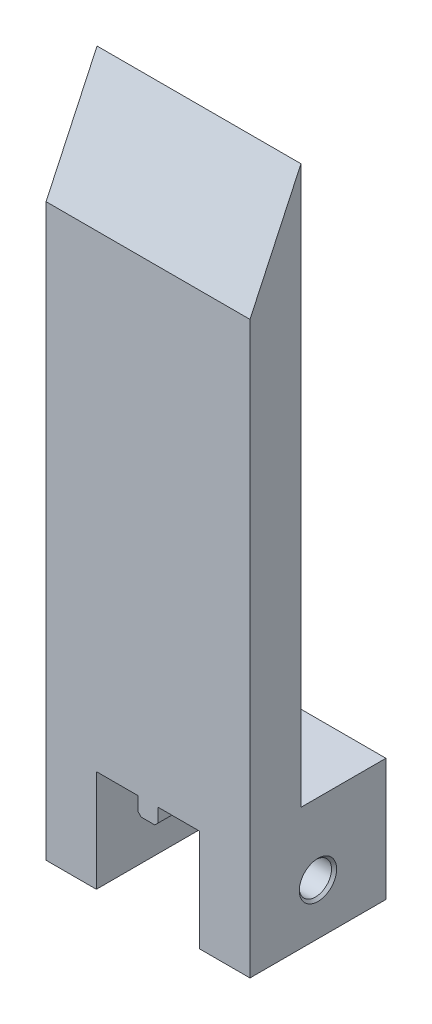
ISO-10303-21;
HEADER;
FILE_DESCRIPTION(('STEP AP214'),'2;1');
FILE_NAME('part.step','',(''),(''),'','','');
FILE_SCHEMA(('AUTOMOTIVE_DESIGN { 1 0 10303 214 1 1 1 1 }'));
ENDSEC;
DATA;
#1=APPLICATION_CONTEXT('core data for automotive mechanical design processes');
#2=APPLICATION_PROTOCOL_DEFINITION('international standard','automotive_design',2000,#1);
#3=PRODUCT_CONTEXT('',#1,'mechanical');
#4=PRODUCT('Part','Part','',(#3));
#5=PRODUCT_RELATED_PRODUCT_CATEGORY('part','',(#4));
#6=PRODUCT_DEFINITION_FORMATION('','',#4);
#7=PRODUCT_DEFINITION_CONTEXT('part definition',#1,'design');
#8=PRODUCT_DEFINITION('design','',#6,#7);
#9=PRODUCT_DEFINITION_SHAPE('','',#8);
#10=(LENGTH_UNIT() NAMED_UNIT(*) SI_UNIT(.MILLI.,.METRE.));
#11=(NAMED_UNIT(*) PLANE_ANGLE_UNIT() SI_UNIT($,.RADIAN.));
#12=(NAMED_UNIT(*) SI_UNIT($,.STERADIAN.) SOLID_ANGLE_UNIT());
#13=UNCERTAINTY_MEASURE_WITH_UNIT(LENGTH_MEASURE(1.E-05),#10,'distance_accuracy_value','');
#14=(GEOMETRIC_REPRESENTATION_CONTEXT(3) GLOBAL_UNCERTAINTY_ASSIGNED_CONTEXT((#13)) GLOBAL_UNIT_ASSIGNED_CONTEXT((#10,
#11,#12)) REPRESENTATION_CONTEXT('',''));
#15=CARTESIAN_POINT('',(0.,0.,0.));
#16=DIRECTION('',(0.,0.,1.));
#17=DIRECTION('',(1.,0.,0.));
#18=AXIS2_PLACEMENT_3D('',#15,#16,#17);
#19=CARTESIAN_POINT('',(-15.,-85.,40.));
#20=DIRECTION('',(0.,1.,0.));
#21=DIRECTION('',(0.,0.,1.));
#22=AXIS2_PLACEMENT_3D('',#19,#20,#21);
#23=PLANE('',#22);
#24=CARTESIAN_POINT('',(0.,-85.,10.0000000000002));
#25=DIRECTION('',(0.,1.,0.));
#26=DIRECTION('',(0.,0.,1.));
#27=AXIS2_PLACEMENT_3D('',#24,#25,#26);
#28=CIRCLE('',#27,2.75000000000001);
#29=CARTESIAN_POINT('',(0.,-85.,12.7500000000002));
#30=VERTEX_POINT('',#29);
#31=EDGE_CURVE('E300',#30,#30,#28,.T.);
#32=ORIENTED_EDGE('',*,*,#31,.T.);
#33=EDGE_LOOP('',(#32));
#34=FACE_BOUND('',#33,.T.);
#35=DIRECTION('',(0.,0.,-1.));
#36=VECTOR('',#35,1.);
#37=CARTESIAN_POINT('',(15.2,-85.,40.));
#38=LINE('',#37,#36);
#39=CARTESIAN_POINT('',(15.2,-85.,40.));
#40=VERTEX_POINT('',#39);
#41=CARTESIAN_POINT('',(15.2,-85.,0.));
#42=VERTEX_POINT('',#41);
#43=EDGE_CURVE('E64',#40,#42,#38,.T.);
#44=ORIENTED_EDGE('',*,*,#43,.F.);
#45=DIRECTION('',(1.,0.,0.));
#46=VECTOR('',#45,1.);
#47=CARTESIAN_POINT('',(-15.,-85.,40.));
#48=LINE('',#47,#46);
#49=CARTESIAN_POINT('',(3.00000000000001,-85.,40.));
#50=VERTEX_POINT('',#49);
#51=EDGE_CURVE('E319',#50,#40,#48,.T.);
#52=ORIENTED_EDGE('',*,*,#51,.F.);
#53=DIRECTION('',(0.,0.,1.));
#54=VECTOR('',#53,1.);
#55=CARTESIAN_POINT('',(3.00000000000001,-85.,40.));
#56=LINE('',#55,#54);
#57=CARTESIAN_POINT('',(3.00000000000001,-85.,25.));
#58=VERTEX_POINT('',#57);
#59=EDGE_CURVE('E255',#58,#50,#56,.T.);
#60=ORIENTED_EDGE('',*,*,#59,.F.);
#61=DIRECTION('',(1.,0.,0.));
#62=VECTOR('',#61,1.);
#63=CARTESIAN_POINT('',(3.00000000000001,-85.,25.));
#64=LINE('',#63,#62);
#65=CARTESIAN_POINT('',(-2.99999999999999,-85.,25.));
#66=VERTEX_POINT('',#65);
#67=EDGE_CURVE('E261',#66,#58,#64,.T.);
#68=ORIENTED_EDGE('',*,*,#67,.F.);
#69=DIRECTION('',(0.,0.,-1.));
#70=VECTOR('',#69,1.);
#71=CARTESIAN_POINT('',(-2.99999999999999,-85.,40.));
#72=LINE('',#71,#70);
#73=CARTESIAN_POINT('',(-2.99999999999999,-85.,40.));
#74=VERTEX_POINT('',#73);
#75=EDGE_CURVE('E269',#74,#66,#72,.T.);
#76=ORIENTED_EDGE('',*,*,#75,.F.);
#77=CARTESIAN_POINT('',(-15.2,-85.,40.));
#78=VERTEX_POINT('',#77);
#79=EDGE_CURVE('E315',#78,#74,#48,.T.);
#80=ORIENTED_EDGE('',*,*,#79,.F.);
#81=DIRECTION('',(0.,0.,1.));
#82=VECTOR('',#81,1.);
#83=CARTESIAN_POINT('',(-15.2,-85.,40.));
#84=LINE('',#83,#82);
#85=CARTESIAN_POINT('',(-15.2,-85.,0.));
#86=VERTEX_POINT('',#85);
#87=EDGE_CURVE('E196',#86,#78,#84,.T.);
#88=ORIENTED_EDGE('',*,*,#87,.F.);
#89=DIRECTION('',(1.,0.,0.));
#90=VECTOR('',#89,1.);
#91=CARTESIAN_POINT('',(-15.,-85.,0.));
#92=LINE('',#91,#90);
#93=EDGE_CURVE('E69',#86,#42,#92,.T.);
#94=ORIENTED_EDGE('',*,*,#93,.T.);
#95=EDGE_LOOP('',(#44,#52,#60,#68,#76,#80,#88,#94));
#96=FACE_BOUND('',#95,.T.);
#97=ADVANCED_FACE('F47',(#34,#96),#23,.F.);
#98=CARTESIAN_POINT('',(0.,0.,40.));
#99=DIRECTION('',(0.,0.,1.));
#100=DIRECTION('',(1.,0.,0.));
#101=AXIS2_PLACEMENT_3D('',#98,#99,#100);
#102=PLANE('',#101);
#103=DIRECTION('',(-1.,0.,0.));
#104=VECTOR('',#103,1.);
#105=CARTESIAN_POINT('',(3.00000000000001,-90.,40.));
#106=LINE('',#105,#104);
#107=CARTESIAN_POINT('',(2.00000000000001,-90.,40.));
#108=VERTEX_POINT('',#107);
#109=CARTESIAN_POINT('',(-1.99999999999996,-90.,40.));
#110=VERTEX_POINT('',#109);
#111=EDGE_CURVE('E256',#108,#110,#106,.T.);
#112=ORIENTED_EDGE('',*,*,#111,.F.);
#113=DIRECTION('',(-0.707106781186548,-0.707106781186548,0.));
#114=VECTOR('',#113,1.);
#115=CARTESIAN_POINT('',(46.,-46.,40.));
#116=LINE('',#115,#114);
#117=CARTESIAN_POINT('',(3.00000000000001,-89.,40.));
#118=VERTEX_POINT('',#117);
#119=EDGE_CURVE('E332',#108,#118,#116,.F.);
#120=ORIENTED_EDGE('',*,*,#119,.T.);
#121=DIRECTION('',(0.,1.,0.));
#122=VECTOR('',#121,1.);
#123=CARTESIAN_POINT('',(3.00000000000001,-90.,40.));
#124=LINE('',#123,#122);
#125=EDGE_CURVE('E285',#118,#50,#124,.T.);
#126=ORIENTED_EDGE('',*,*,#125,.T.);
#127=ORIENTED_EDGE('',*,*,#51,.T.);
#128=DIRECTION('',(0.,1.,0.));
#129=VECTOR('',#128,1.);
#130=CARTESIAN_POINT('',(15.2,-115.,40.));
#131=LINE('',#130,#129);
#132=CARTESIAN_POINT('',(15.2,-115.,40.));
#133=VERTEX_POINT('',#132);
#134=EDGE_CURVE('E377',#133,#40,#131,.T.);
#135=ORIENTED_EDGE('',*,*,#134,.F.);
#136=DIRECTION('',(-1.,0.,0.));
#137=VECTOR('',#136,1.);
#138=CARTESIAN_POINT('',(30.,-115.,40.));
#139=LINE('',#138,#137);
#140=CARTESIAN_POINT('',(30.,-115.,40.));
#141=VERTEX_POINT('',#140);
#142=EDGE_CURVE('E192',#141,#133,#139,.T.);
#143=ORIENTED_EDGE('',*,*,#142,.F.);
#144=DIRECTION('',(0.,1.,0.));
#145=VECTOR('',#144,1.);
#146=CARTESIAN_POINT('',(30.,-85.,40.));
#147=LINE('',#146,#145);
#148=CARTESIAN_POINT('',(30.,52.8323961923561,40.));
#149=VERTEX_POINT('',#148);
#150=EDGE_CURVE('E174',#141,#149,#147,.T.);
#151=ORIENTED_EDGE('',*,*,#150,.T.);
#152=DIRECTION('',(1.,0.,0.));
#153=VECTOR('',#152,1.);
#154=CARTESIAN_POINT('',(-15.,52.8323961923561,40.));
#155=LINE('',#154,#153);
#156=CARTESIAN_POINT('',(-30.,52.8323961923561,40.));
#157=VERTEX_POINT('',#156);
#158=EDGE_CURVE('E307',#157,#149,#155,.T.);
#159=ORIENTED_EDGE('',*,*,#158,.F.);
#160=DIRECTION('',(0.,1.,0.));
#161=VECTOR('',#160,1.);
#162=CARTESIAN_POINT('',(-30.,-85.,40.));
#163=LINE('',#162,#161);
#164=CARTESIAN_POINT('',(-30.,-115.,40.));
#165=VERTEX_POINT('',#164);
#166=EDGE_CURVE('E247',#165,#157,#163,.T.);
#167=ORIENTED_EDGE('',*,*,#166,.F.);
#168=DIRECTION('',(-1.,0.,0.));
#169=VECTOR('',#168,1.);
#170=CARTESIAN_POINT('',(-30.,-115.,40.));
#171=LINE('',#170,#169);
#172=CARTESIAN_POINT('',(-15.2,-115.,40.));
#173=VERTEX_POINT('',#172);
#174=EDGE_CURVE('E211',#173,#165,#171,.T.);
#175=ORIENTED_EDGE('',*,*,#174,.F.);
#176=DIRECTION('',(0.,1.,0.));
#177=VECTOR('',#176,1.);
#178=CARTESIAN_POINT('',(-15.2,-115.,40.));
#179=LINE('',#178,#177);
#180=EDGE_CURVE('E215',#173,#78,#179,.T.);
#181=ORIENTED_EDGE('',*,*,#180,.T.);
#182=ORIENTED_EDGE('',*,*,#79,.T.);
#183=DIRECTION('',(0.,1.,0.));
#184=VECTOR('',#183,1.);
#185=CARTESIAN_POINT('',(-2.99999999999999,-90.,40.));
#186=LINE('',#185,#184);
#187=CARTESIAN_POINT('',(-2.99999999999999,-89.,40.));
#188=VERTEX_POINT('',#187);
#189=EDGE_CURVE('E281',#188,#74,#186,.T.);
#190=ORIENTED_EDGE('',*,*,#189,.F.);
#191=DIRECTION('',(-0.707106781186548,0.707106781186547,0.));
#192=VECTOR('',#191,1.);
#193=CARTESIAN_POINT('',(-46.,-46.,40.));
#194=LINE('',#193,#192);
#195=EDGE_CURVE('E329',#188,#110,#194,.F.);
#196=ORIENTED_EDGE('',*,*,#195,.T.);
#197=EDGE_LOOP('',(#112,#120,#126,#127,#135,#143,#151,#159,#167,#175,#181,#182,#190,#196));
#198=FACE_BOUND('',#197,.T.);
#199=ADVANCED_FACE('F356',(#198),#102,.T.);
#200=CARTESIAN_POINT('',(0.,0.,0.));
#201=DIRECTION('',(0.,0.,1.));
#202=DIRECTION('',(1.,0.,0.));
#203=AXIS2_PLACEMENT_3D('',#200,#201,#202);
#204=PLANE('',#203);
#205=ORIENTED_EDGE('',*,*,#93,.F.);
#206=DIRECTION('',(0.,1.,0.));
#207=VECTOR('',#206,1.);
#208=CARTESIAN_POINT('',(-15.2,-115.,0.));
#209=LINE('',#208,#207);
#210=CARTESIAN_POINT('',(-15.2,-115.,0.));
#211=VERTEX_POINT('',#210);
#212=EDGE_CURVE('E221',#211,#86,#209,.T.);
#213=ORIENTED_EDGE('',*,*,#212,.F.);
#214=DIRECTION('',(1.,0.,0.));
#215=VECTOR('',#214,1.);
#216=CARTESIAN_POINT('',(-30.,-115.,0.));
#217=LINE('',#216,#215);
#218=CARTESIAN_POINT('',(-30.,-115.,0.));
#219=VERTEX_POINT('',#218);
#220=EDGE_CURVE('E205',#219,#211,#217,.T.);
#221=ORIENTED_EDGE('',*,*,#220,.F.);
#222=DIRECTION('',(0.,-1.,0.));
#223=VECTOR('',#222,1.);
#224=CARTESIAN_POINT('',(-30.,-79.,0.));
#225=LINE('',#224,#223);
#226=CARTESIAN_POINT('',(-30.,-79.,0.));
#227=VERTEX_POINT('',#226);
#228=EDGE_CURVE('E244',#227,#219,#225,.T.);
#229=ORIENTED_EDGE('',*,*,#228,.F.);
#230=DIRECTION('',(-1.,0.,0.));
#231=VECTOR('',#230,1.);
#232=CARTESIAN_POINT('',(15.,-79.,0.));
#233=LINE('',#232,#231);
#234=CARTESIAN_POINT('',(30.,-79.,0.));
#235=VERTEX_POINT('',#234);
#236=EDGE_CURVE('E167',#235,#227,#233,.T.);
#237=ORIENTED_EDGE('',*,*,#236,.F.);
#238=DIRECTION('',(0.,-1.,0.));
#239=VECTOR('',#238,1.);
#240=CARTESIAN_POINT('',(30.,-79.,0.));
#241=LINE('',#240,#239);
#242=CARTESIAN_POINT('',(30.,-115.,0.));
#243=VERTEX_POINT('',#242);
#244=EDGE_CURVE('E161',#235,#243,#241,.T.);
#245=ORIENTED_EDGE('',*,*,#244,.T.);
#246=DIRECTION('',(1.,0.,0.));
#247=VECTOR('',#246,1.);
#248=CARTESIAN_POINT('',(30.,-115.,0.));
#249=LINE('',#248,#247);
#250=CARTESIAN_POINT('',(15.2,-115.,0.));
#251=VERTEX_POINT('',#250);
#252=EDGE_CURVE('E165',#251,#243,#249,.T.);
#253=ORIENTED_EDGE('',*,*,#252,.F.);
#254=DIRECTION('',(0.,1.,0.));
#255=VECTOR('',#254,1.);
#256=CARTESIAN_POINT('',(15.2,-115.,0.));
#257=LINE('',#256,#255);
#258=EDGE_CURVE('E184',#251,#42,#257,.T.);
#259=ORIENTED_EDGE('',*,*,#258,.T.);
#260=EDGE_LOOP('',(#205,#213,#221,#229,#237,#245,#253,#259));
#261=FACE_BOUND('',#260,.T.);
#262=ADVANCED_FACE('F163',(#261),#204,.F.);
#263=CARTESIAN_POINT('',(-15.,52.8323961923561,40.));
#264=DIRECTION('',(0.,-0.422618261740693,-0.906307787036653));
#265=DIRECTION('',(0.,0.906307787036653,-0.422618261740693));
#266=AXIS2_PLACEMENT_3D('',#263,#264,#265);
#267=PLANE('',#266);
#268=ORIENTED_EDGE('',*,*,#158,.T.);
#269=DIRECTION('',(0.,0.906307787036653,-0.422618261740694));
#270=VECTOR('',#269,1.);
#271=CARTESIAN_POINT('',(30.,52.8323961923561,40.));
#272=LINE('',#271,#270);
#273=CARTESIAN_POINT('',(30.,85.,25.));
#274=VERTEX_POINT('',#273);
#275=EDGE_CURVE('E228',#149,#274,#272,.T.);
#276=ORIENTED_EDGE('',*,*,#275,.T.);
#277=DIRECTION('',(1.,0.,0.));
#278=VECTOR('',#277,1.);
#279=CARTESIAN_POINT('',(-15.,85.,25.));
#280=LINE('',#279,#278);
#281=CARTESIAN_POINT('',(-30.,85.,25.));
#282=VERTEX_POINT('',#281);
#283=EDGE_CURVE('E310',#282,#274,#280,.T.);
#284=ORIENTED_EDGE('',*,*,#283,.F.);
#285=DIRECTION('',(0.,0.906307787036653,-0.422618261740694));
#286=VECTOR('',#285,1.);
#287=CARTESIAN_POINT('',(-30.,52.8323961923561,40.));
#288=LINE('',#287,#286);
#289=EDGE_CURVE('E251',#157,#282,#288,.T.);
#290=ORIENTED_EDGE('',*,*,#289,.F.);
#291=EDGE_LOOP('',(#268,#276,#284,#290));
#292=FACE_BOUND('',#291,.T.);
#293=ADVANCED_FACE('F439',(#292),#267,.F.);
#294=CARTESIAN_POINT('',(15.,85.,25.));
#295=DIRECTION('',(0.,0.,1.));
#296=DIRECTION('',(0.,-1.,0.));
#297=AXIS2_PLACEMENT_3D('',#294,#295,#296);
#298=PLANE('',#297);
#299=DIRECTION('',(-1.,0.,0.));
#300=VECTOR('',#299,1.);
#301=CARTESIAN_POINT('',(15.,-79.,25.));
#302=LINE('',#301,#300);
#303=CARTESIAN_POINT('',(30.,-79.,25.));
#304=VERTEX_POINT('',#303);
#305=CARTESIAN_POINT('',(-30.,-79.,25.));
#306=VERTEX_POINT('',#305);
#307=EDGE_CURVE('E304',#304,#306,#302,.T.);
#308=ORIENTED_EDGE('',*,*,#307,.T.);
#309=DIRECTION('',(0.,-1.,0.));
#310=VECTOR('',#309,1.);
#311=CARTESIAN_POINT('',(-30.,85.,25.));
#312=LINE('',#311,#310);
#313=EDGE_CURVE('E236',#282,#306,#312,.T.);
#314=ORIENTED_EDGE('',*,*,#313,.F.);
#315=ORIENTED_EDGE('',*,*,#283,.T.);
#316=DIRECTION('',(0.,-1.,0.));
#317=VECTOR('',#316,1.);
#318=CARTESIAN_POINT('',(30.,85.,25.));
#319=LINE('',#318,#317);
#320=EDGE_CURVE('E224',#274,#304,#319,.T.);
#321=ORIENTED_EDGE('',*,*,#320,.T.);
#322=EDGE_LOOP('',(#308,#314,#315,#321));
#323=FACE_BOUND('',#322,.T.);
#324=ADVANCED_FACE('F435',(#323),#298,.F.);
#325=CARTESIAN_POINT('',(15.,-79.,0.));
#326=DIRECTION('',(0.,-1.,0.));
#327=DIRECTION('',(0.,0.,-1.));
#328=AXIS2_PLACEMENT_3D('',#325,#326,#327);
#329=PLANE('',#328);
#330=CARTESIAN_POINT('',(0.,-79.,10.0000000000002));
#331=DIRECTION('',(0.,1.,0.));
#332=DIRECTION('',(0.,0.,1.));
#333=AXIS2_PLACEMENT_3D('',#330,#331,#332);
#334=CIRCLE('',#333,5.5);
#335=CARTESIAN_POINT('',(0.,-79.,15.5000000000002));
#336=VERTEX_POINT('',#335);
#337=EDGE_CURVE('E288',#336,#336,#334,.T.);
#338=ORIENTED_EDGE('',*,*,#337,.F.);
#339=EDGE_LOOP('',(#338));
#340=FACE_BOUND('',#339,.T.);
#341=ORIENTED_EDGE('',*,*,#236,.T.);
#342=DIRECTION('',(0.,0.,-1.));
#343=VECTOR('',#342,1.);
#344=CARTESIAN_POINT('',(-30.,-79.,25.));
#345=LINE('',#344,#343);
#346=EDGE_CURVE('E240',#306,#227,#345,.T.);
#347=ORIENTED_EDGE('',*,*,#346,.F.);
#348=ORIENTED_EDGE('',*,*,#307,.F.);
#349=DIRECTION('',(0.,0.,-1.));
#350=VECTOR('',#349,1.);
#351=CARTESIAN_POINT('',(30.,-79.,25.));
#352=LINE('',#351,#350);
#353=EDGE_CURVE('E173',#304,#235,#352,.T.);
#354=ORIENTED_EDGE('',*,*,#353,.T.);
#355=EDGE_LOOP('',(#341,#347,#348,#354));
#356=FACE_BOUND('',#355,.T.);
#357=ADVANCED_FACE('F437',(#340,#356),#329,.F.);
#358=CARTESIAN_POINT('',(0.,-79.,10.0000000000002));
#359=DIRECTION('',(0.,1.,0.));
#360=DIRECTION('',(0.,0.,1.));
#361=AXIS2_PLACEMENT_3D('',#358,#359,#360);
#362=CYLINDRICAL_SURFACE('',#361,2.75);
#363=ORIENTED_EDGE('',*,*,#31,.F.);
#364=EDGE_LOOP('',(#363));
#365=FACE_BOUND('',#364,.T.);
#366=CARTESIAN_POINT('',(0.,-82.,10.0000000000002));
#367=DIRECTION('',(0.,1.,0.));
#368=DIRECTION('',(0.,0.,1.));
#369=AXIS2_PLACEMENT_3D('',#366,#367,#368);
#370=CIRCLE('',#369,2.75);
#371=CARTESIAN_POINT('',(0.,-82.,12.7500000000002));
#372=VERTEX_POINT('',#371);
#373=EDGE_CURVE('E296',#372,#372,#370,.T.);
#374=ORIENTED_EDGE('',*,*,#373,.T.);
#375=EDGE_LOOP('',(#374));
#376=FACE_BOUND('',#375,.T.);
#377=ADVANCED_FACE('F489',(#365,#376),#362,.F.);
#378=CARTESIAN_POINT('',(2.75000000000003,-82.,10.0000000000002));
#379=DIRECTION('',(0.,-1.,0.));
#380=DIRECTION('',(0.,0.,-1.));
#381=AXIS2_PLACEMENT_3D('',#378,#379,#380);
#382=PLANE('',#381);
#383=ORIENTED_EDGE('',*,*,#373,.F.);
#384=EDGE_LOOP('',(#383));
#385=FACE_BOUND('',#384,.T.);
#386=CARTESIAN_POINT('',(0.,-82.,10.0000000000002));
#387=DIRECTION('',(0.,1.,0.));
#388=DIRECTION('',(0.,0.,1.));
#389=AXIS2_PLACEMENT_3D('',#386,#387,#388);
#390=CIRCLE('',#389,5.5);
#391=CARTESIAN_POINT('',(0.,-82.,15.5000000000002));
#392=VERTEX_POINT('',#391);
#393=EDGE_CURVE('E292',#392,#392,#390,.T.);
#394=ORIENTED_EDGE('',*,*,#393,.T.);
#395=EDGE_LOOP('',(#394));
#396=FACE_BOUND('',#395,.T.);
#397=ADVANCED_FACE('F485',(#385,#396),#382,.F.);
#398=CARTESIAN_POINT('',(0.,-79.,10.0000000000002));
#399=DIRECTION('',(0.,1.,0.));
#400=DIRECTION('',(0.,0.,1.));
#401=AXIS2_PLACEMENT_3D('',#398,#399,#400);
#402=CYLINDRICAL_SURFACE('',#401,5.5);
#403=ORIENTED_EDGE('',*,*,#393,.F.);
#404=EDGE_LOOP('',(#403));
#405=FACE_BOUND('',#404,.T.);
#406=ORIENTED_EDGE('',*,*,#337,.T.);
#407=EDGE_LOOP('',(#406));
#408=FACE_BOUND('',#407,.T.);
#409=ADVANCED_FACE('F482',(#405,#408),#402,.F.);
#410=CARTESIAN_POINT('',(3.00000000000001,-90.,40.));
#411=DIRECTION('',(-1.,0.,0.));
#412=DIRECTION('',(0.,0.,1.));
#413=AXIS2_PLACEMENT_3D('',#410,#411,#412);
#414=PLANE('',#413);
#415=ORIENTED_EDGE('',*,*,#125,.F.);
#416=DIRECTION('',(0.,0.,-1.));
#417=VECTOR('',#416,1.);
#418=CARTESIAN_POINT('',(3.00000000000001,-89.,40.));
#419=LINE('',#418,#417);
#420=CARTESIAN_POINT('',(3.00000000000001,-89.,25.));
#421=VERTEX_POINT('',#420);
#422=EDGE_CURVE('E335',#118,#421,#419,.T.);
#423=ORIENTED_EDGE('',*,*,#422,.T.);
#424=DIRECTION('',(0.,1.,0.));
#425=VECTOR('',#424,1.);
#426=CARTESIAN_POINT('',(3.00000000000001,-90.,25.));
#427=LINE('',#426,#425);
#428=EDGE_CURVE('E265',#421,#58,#427,.T.);
#429=ORIENTED_EDGE('',*,*,#428,.T.);
#430=ORIENTED_EDGE('',*,*,#59,.T.);
#431=EDGE_LOOP('',(#415,#423,#429,#430));
#432=FACE_BOUND('',#431,.T.);
#433=ADVANCED_FACE('F358',(#432),#414,.F.);
#434=CARTESIAN_POINT('',(-2.99999999999999,-90.,40.));
#435=DIRECTION('',(1.,0.,0.));
#436=DIRECTION('',(0.,0.,-1.));
#437=AXIS2_PLACEMENT_3D('',#434,#435,#436);
#438=PLANE('',#437);
#439=DIRECTION('',(0.,1.,0.));
#440=VECTOR('',#439,1.);
#441=CARTESIAN_POINT('',(-2.99999999999999,-90.,25.));
#442=LINE('',#441,#440);
#443=CARTESIAN_POINT('',(-2.99999999999999,-89.,25.));
#444=VERTEX_POINT('',#443);
#445=EDGE_CURVE('E278',#444,#66,#442,.T.);
#446=ORIENTED_EDGE('',*,*,#445,.F.);
#447=DIRECTION('',(0.,0.,1.));
#448=VECTOR('',#447,1.);
#449=CARTESIAN_POINT('',(-2.99999999999999,-89.,40.));
#450=LINE('',#449,#448);
#451=EDGE_CURVE('E11',#444,#188,#450,.T.);
#452=ORIENTED_EDGE('',*,*,#451,.T.);
#453=ORIENTED_EDGE('',*,*,#189,.T.);
#454=ORIENTED_EDGE('',*,*,#75,.T.);
#455=EDGE_LOOP('',(#446,#452,#453,#454));
#456=FACE_BOUND('',#455,.T.);
#457=ADVANCED_FACE('F365',(#456),#438,.F.);
#458=CARTESIAN_POINT('',(3.00000000000001,-90.,25.));
#459=DIRECTION('',(0.,0.,1.));
#460=DIRECTION('',(1.,0.,0.));
#461=AXIS2_PLACEMENT_3D('',#458,#459,#460);
#462=PLANE('',#461);
#463=ORIENTED_EDGE('',*,*,#428,.F.);
#464=DIRECTION('',(0.707106781186548,0.707106781186548,0.));
#465=VECTOR('',#464,1.);
#466=CARTESIAN_POINT('',(2.00000000000001,-90.,25.));
#467=LINE('',#466,#465);
#468=CARTESIAN_POINT('',(2.00000000000001,-90.,25.));
#469=VERTEX_POINT('',#468);
#470=EDGE_CURVE('E57',#421,#469,#467,.F.);
#471=ORIENTED_EDGE('',*,*,#470,.T.);
#472=DIRECTION('',(1.,0.,0.));
#473=VECTOR('',#472,1.);
#474=CARTESIAN_POINT('',(3.00000000000001,-90.,25.));
#475=LINE('',#474,#473);
#476=CARTESIAN_POINT('',(-1.99999999999996,-90.,25.));
#477=VERTEX_POINT('',#476);
#478=EDGE_CURVE('E260',#477,#469,#475,.T.);
#479=ORIENTED_EDGE('',*,*,#478,.F.);
#480=DIRECTION('',(0.707106781186548,-0.707106781186547,0.));
#481=VECTOR('',#480,1.);
#482=CARTESIAN_POINT('',(-1.99999999999996,-90.,25.));
#483=LINE('',#482,#481);
#484=EDGE_CURVE('E338',#477,#444,#483,.F.);
#485=ORIENTED_EDGE('',*,*,#484,.T.);
#486=ORIENTED_EDGE('',*,*,#445,.T.);
#487=ORIENTED_EDGE('',*,*,#67,.T.);
#488=EDGE_LOOP('',(#463,#471,#479,#485,#486,#487));
#489=FACE_BOUND('',#488,.T.);
#490=ADVANCED_FACE('F345',(#489),#462,.F.);
#491=CARTESIAN_POINT('',(0.,-90.,0.));
#492=DIRECTION('',(0.,1.,0.));
#493=DIRECTION('',(0.,0.,1.));
#494=AXIS2_PLACEMENT_3D('',#491,#492,#493);
#495=PLANE('',#494);
#496=ORIENTED_EDGE('',*,*,#478,.T.);
#497=DIRECTION('',(0.,0.,1.));
#498=VECTOR('',#497,1.);
#499=CARTESIAN_POINT('',(2.00000000000001,-90.,0.));
#500=LINE('',#499,#498);
#501=EDGE_CURVE('E325',#469,#108,#500,.T.);
#502=ORIENTED_EDGE('',*,*,#501,.T.);
#503=ORIENTED_EDGE('',*,*,#111,.T.);
#504=DIRECTION('',(0.,0.,-1.));
#505=VECTOR('',#504,1.);
#506=CARTESIAN_POINT('',(-1.99999999999996,-90.,0.));
#507=LINE('',#506,#505);
#508=EDGE_CURVE('E318',#110,#477,#507,.T.);
#509=ORIENTED_EDGE('',*,*,#508,.T.);
#510=EDGE_LOOP('',(#496,#502,#503,#509));
#511=FACE_BOUND('',#510,.T.);
#512=ADVANCED_FACE('F350',(#511),#495,.F.);
#513=CARTESIAN_POINT('',(2.00000000000001,-90.,0.));
#514=DIRECTION('',(-0.707106781186547,0.707106781186547,0.));
#515=DIRECTION('',(0.,0.,1.));
#516=AXIS2_PLACEMENT_3D('',#513,#514,#515);
#517=PLANE('',#516);
#518=ORIENTED_EDGE('',*,*,#470,.F.);
#519=ORIENTED_EDGE('',*,*,#422,.F.);
#520=ORIENTED_EDGE('',*,*,#119,.F.);
#521=ORIENTED_EDGE('',*,*,#501,.F.);
#522=EDGE_LOOP('',(#518,#519,#520,#521));
#523=FACE_BOUND('',#522,.T.);
#524=ADVANCED_FACE('F353',(#523),#517,.F.);
#525=CARTESIAN_POINT('',(-1.99999999999996,-90.,0.));
#526=DIRECTION('',(0.707106781186547,0.707106781186548,0.));
#527=DIRECTION('',(0.,0.,-1.));
#528=AXIS2_PLACEMENT_3D('',#525,#526,#527);
#529=PLANE('',#528);
#530=ORIENTED_EDGE('',*,*,#195,.F.);
#531=ORIENTED_EDGE('',*,*,#451,.F.);
#532=ORIENTED_EDGE('',*,*,#484,.F.);
#533=ORIENTED_EDGE('',*,*,#508,.F.);
#534=EDGE_LOOP('',(#530,#531,#532,#533));
#535=FACE_BOUND('',#534,.T.);
#536=ADVANCED_FACE('F50',(#535),#529,.F.);
#537=CARTESIAN_POINT('',(-30.,0.,0.));
#538=DIRECTION('',(1.,0.,0.));
#539=DIRECTION('',(0.,1.,0.));
#540=AXIS2_PLACEMENT_3D('',#537,#538,#539);
#541=PLANE('',#540);
#542=CARTESIAN_POINT('',(-30.,-100.,20.));
#543=DIRECTION('',(-1.,0.,0.));
#544=DIRECTION('',(0.,0.,1.));
#545=AXIS2_PLACEMENT_3D('',#542,#543,#544);
#546=CIRCLE('',#545,5.50000000000001);
#547=CARTESIAN_POINT('',(-30.,-100.,25.5));
#548=VERTEX_POINT('',#547);
#549=EDGE_CURVE('E420',#548,#548,#546,.T.);
#550=ORIENTED_EDGE('',*,*,#549,.F.);
#551=EDGE_LOOP('',(#550));
#552=FACE_BOUND('',#551,.T.);
#553=ORIENTED_EDGE('',*,*,#313,.T.);
#554=ORIENTED_EDGE('',*,*,#346,.T.);
#555=ORIENTED_EDGE('',*,*,#228,.T.);
#556=DIRECTION('',(0.,0.,-1.));
#557=VECTOR('',#556,1.);
#558=CARTESIAN_POINT('',(-30.,-115.,40.));
#559=LINE('',#558,#557);
#560=EDGE_CURVE('E201',#165,#219,#559,.T.);
#561=ORIENTED_EDGE('',*,*,#560,.F.);
#562=ORIENTED_EDGE('',*,*,#166,.T.);
#563=ORIENTED_EDGE('',*,*,#289,.T.);
#564=EDGE_LOOP('',(#553,#554,#555,#561,#562,#563));
#565=FACE_BOUND('',#564,.T.);
#566=ADVANCED_FACE('F427',(#552,#565),#541,.F.);
#567=CARTESIAN_POINT('',(30.,0.,0.));
#568=DIRECTION('',(-1.,0.,0.));
#569=DIRECTION('',(0.,1.,0.));
#570=AXIS2_PLACEMENT_3D('',#567,#568,#569);
#571=PLANE('',#570);
#572=CARTESIAN_POINT('',(30.,-100.,20.));
#573=DIRECTION('',(1.,0.,0.));
#574=DIRECTION('',(0.,0.,-1.));
#575=AXIS2_PLACEMENT_3D('',#572,#573,#574);
#576=CIRCLE('',#575,5.50000000000001);
#577=CARTESIAN_POINT('',(30.,-100.,14.5));
#578=VERTEX_POINT('',#577);
#579=EDGE_CURVE('E400',#578,#578,#576,.T.);
#580=ORIENTED_EDGE('',*,*,#579,.F.);
#581=EDGE_LOOP('',(#580));
#582=FACE_BOUND('',#581,.T.);
#583=ORIENTED_EDGE('',*,*,#320,.F.);
#584=ORIENTED_EDGE('',*,*,#275,.F.);
#585=ORIENTED_EDGE('',*,*,#150,.F.);
#586=DIRECTION('',(0.,0.,1.));
#587=VECTOR('',#586,1.);
#588=CARTESIAN_POINT('',(30.,-115.,40.));
#589=LINE('',#588,#587);
#590=EDGE_CURVE('E179',#243,#141,#589,.T.);
#591=ORIENTED_EDGE('',*,*,#590,.F.);
#592=ORIENTED_EDGE('',*,*,#244,.F.);
#593=ORIENTED_EDGE('',*,*,#353,.F.);
#594=EDGE_LOOP('',(#583,#584,#585,#591,#592,#593));
#595=FACE_BOUND('',#594,.T.);
#596=ADVANCED_FACE('F187',(#582,#595),#571,.F.);
#597=CARTESIAN_POINT('',(-15.2,-115.,40.));
#598=DIRECTION('',(-1.,0.,0.));
#599=DIRECTION('',(0.,0.,1.));
#600=AXIS2_PLACEMENT_3D('',#597,#598,#599);
#601=PLANE('',#600);
#602=CARTESIAN_POINT('',(-15.2,-100.,20.));
#603=DIRECTION('',(-1.,0.,0.));
#604=DIRECTION('',(0.,0.,1.));
#605=AXIS2_PLACEMENT_3D('',#602,#603,#604);
#606=CIRCLE('',#605,2.75);
#607=CARTESIAN_POINT('',(-15.2,-100.,22.75));
#608=VERTEX_POINT('',#607);
#609=EDGE_CURVE('E404',#608,#608,#606,.T.);
#610=ORIENTED_EDGE('',*,*,#609,.T.);
#611=EDGE_LOOP('',(#610));
#612=FACE_BOUND('',#611,.T.);
#613=ORIENTED_EDGE('',*,*,#87,.T.);
#614=ORIENTED_EDGE('',*,*,#180,.F.);
#615=DIRECTION('',(0.,0.,1.));
#616=VECTOR('',#615,1.);
#617=CARTESIAN_POINT('',(-15.2,-115.,40.));
#618=LINE('',#617,#616);
#619=EDGE_CURVE('E208',#211,#173,#618,.T.);
#620=ORIENTED_EDGE('',*,*,#619,.F.);
#621=ORIENTED_EDGE('',*,*,#212,.T.);
#622=EDGE_LOOP('',(#613,#614,#620,#621));
#623=FACE_BOUND('',#622,.T.);
#624=ADVANCED_FACE('F444',(#612,#623),#601,.F.);
#625=CARTESIAN_POINT('',(0.,-115.,0.));
#626=DIRECTION('',(0.,-1.,0.));
#627=DIRECTION('',(0.,0.,-1.));
#628=AXIS2_PLACEMENT_3D('',#625,#626,#627);
#629=PLANE('',#628);
#630=ORIENTED_EDGE('',*,*,#560,.T.);
#631=ORIENTED_EDGE('',*,*,#220,.T.);
#632=ORIENTED_EDGE('',*,*,#619,.T.);
#633=ORIENTED_EDGE('',*,*,#174,.T.);
#634=EDGE_LOOP('',(#630,#631,#632,#633));
#635=FACE_BOUND('',#634,.T.);
#636=ADVANCED_FACE('F443',(#635),#629,.T.);
#637=CARTESIAN_POINT('',(15.2,-115.,40.));
#638=DIRECTION('',(1.,0.,0.));
#639=DIRECTION('',(0.,0.,-1.));
#640=AXIS2_PLACEMENT_3D('',#637,#638,#639);
#641=PLANE('',#640);
#642=CARTESIAN_POINT('',(15.2,-100.,20.));
#643=DIRECTION('',(1.,0.,0.));
#644=DIRECTION('',(0.,0.,-1.));
#645=AXIS2_PLACEMENT_3D('',#642,#643,#644);
#646=CIRCLE('',#645,2.75);
#647=CARTESIAN_POINT('',(15.2,-100.,17.25));
#648=VERTEX_POINT('',#647);
#649=EDGE_CURVE('E381',#648,#648,#646,.T.);
#650=ORIENTED_EDGE('',*,*,#649,.T.);
#651=EDGE_LOOP('',(#650));
#652=FACE_BOUND('',#651,.T.);
#653=ORIENTED_EDGE('',*,*,#43,.T.);
#654=ORIENTED_EDGE('',*,*,#258,.F.);
#655=DIRECTION('',(0.,0.,-1.));
#656=VECTOR('',#655,1.);
#657=CARTESIAN_POINT('',(15.2,-115.,40.));
#658=LINE('',#657,#656);
#659=EDGE_CURVE('E181',#133,#251,#658,.T.);
#660=ORIENTED_EDGE('',*,*,#659,.F.);
#661=ORIENTED_EDGE('',*,*,#134,.T.);
#662=EDGE_LOOP('',(#653,#654,#660,#661));
#663=FACE_BOUND('',#662,.T.);
#664=ADVANCED_FACE('F452',(#652,#663),#641,.F.);
#665=CARTESIAN_POINT('',(0.,-115.,0.));
#666=DIRECTION('',(0.,1.,0.));
#667=DIRECTION('',(0.,0.,1.));
#668=AXIS2_PLACEMENT_3D('',#665,#666,#667);
#669=PLANE('',#668);
#670=ORIENTED_EDGE('',*,*,#590,.T.);
#671=ORIENTED_EDGE('',*,*,#142,.T.);
#672=ORIENTED_EDGE('',*,*,#659,.T.);
#673=ORIENTED_EDGE('',*,*,#252,.T.);
#674=EDGE_LOOP('',(#670,#671,#672,#673));
#675=FACE_BOUND('',#674,.T.);
#676=ADVANCED_FACE('F178',(#675),#669,.F.);
#677=CARTESIAN_POINT('',(30.,-100.,20.));
#678=DIRECTION('',(1.,0.,0.));
#679=DIRECTION('',(0.,0.,-1.));
#680=AXIS2_PLACEMENT_3D('',#677,#678,#679);
#681=CYLINDRICAL_SURFACE('',#680,2.75);
#682=ORIENTED_EDGE('',*,*,#649,.F.);
#683=EDGE_LOOP('',(#682));
#684=FACE_BOUND('',#683,.T.);
#685=CARTESIAN_POINT('',(18.,-100.,20.));
#686=DIRECTION('',(1.,0.,0.));
#687=DIRECTION('',(0.,0.,-1.));
#688=AXIS2_PLACEMENT_3D('',#685,#686,#687);
#689=CIRCLE('',#688,2.75);
#690=CARTESIAN_POINT('',(18.,-100.,17.25));
#691=VERTEX_POINT('',#690);
#692=EDGE_CURVE('E388',#691,#691,#689,.T.);
#693=ORIENTED_EDGE('',*,*,#692,.T.);
#694=EDGE_LOOP('',(#693));
#695=FACE_BOUND('',#694,.T.);
#696=ADVANCED_FACE('F706',(#684,#695),#681,.F.);
#697=CARTESIAN_POINT('',(18.,-95.25,20.));
#698=DIRECTION('',(-1.,0.,0.));
#699=DIRECTION('',(0.,0.,1.));
#700=AXIS2_PLACEMENT_3D('',#697,#698,#699);
#701=PLANE('',#700);
#702=ORIENTED_EDGE('',*,*,#692,.F.);
#703=EDGE_LOOP('',(#702));
#704=FACE_BOUND('',#703,.T.);
#705=CARTESIAN_POINT('',(18.,-100.,20.));
#706=DIRECTION('',(1.,0.,0.));
#707=DIRECTION('',(0.,0.,-1.));
#708=AXIS2_PLACEMENT_3D('',#705,#706,#707);
#709=CIRCLE('',#708,4.75);
#710=CARTESIAN_POINT('',(18.,-100.,15.25));
#711=VERTEX_POINT('',#710);
#712=EDGE_CURVE('E392',#711,#711,#709,.T.);
#713=ORIENTED_EDGE('',*,*,#712,.T.);
#714=EDGE_LOOP('',(#713));
#715=FACE_BOUND('',#714,.T.);
#716=ADVANCED_FACE('F715',(#704,#715),#701,.F.);
#717=CARTESIAN_POINT('',(30.,-100.,20.));
#718=DIRECTION('',(1.,0.,0.));
#719=DIRECTION('',(0.,0.,-1.));
#720=AXIS2_PLACEMENT_3D('',#717,#718,#719);
#721=CYLINDRICAL_SURFACE('',#720,4.75);
#722=ORIENTED_EDGE('',*,*,#712,.F.);
#723=EDGE_LOOP('',(#722));
#724=FACE_BOUND('',#723,.T.);
#725=CARTESIAN_POINT('',(29.25,-100.,20.));
#726=DIRECTION('',(1.,0.,0.));
#727=DIRECTION('',(0.,0.,-1.));
#728=AXIS2_PLACEMENT_3D('',#725,#726,#727);
#729=CIRCLE('',#728,4.75);
#730=CARTESIAN_POINT('',(29.25,-100.,15.25));
#731=VERTEX_POINT('',#730);
#732=EDGE_CURVE('E396',#731,#731,#729,.T.);
#733=ORIENTED_EDGE('',*,*,#732,.T.);
#734=EDGE_LOOP('',(#733));
#735=FACE_BOUND('',#734,.T.);
#736=ADVANCED_FACE('F726',(#724,#735),#721,.F.);
#737=CARTESIAN_POINT('',(30.,-100.,20.));
#738=DIRECTION('',(1.,0.,0.));
#739=DIRECTION('',(0.,0.,-1.));
#740=AXIS2_PLACEMENT_3D('',#737,#738,#739);
#741=CONICAL_SURFACE('',#740,5.50000000000001,0.785398163397448);
#742=ORIENTED_EDGE('',*,*,#732,.F.);
#743=EDGE_LOOP('',(#742));
#744=FACE_BOUND('',#743,.T.);
#745=ORIENTED_EDGE('',*,*,#579,.T.);
#746=EDGE_LOOP('',(#745));
#747=FACE_BOUND('',#746,.T.);
#748=ADVANCED_FACE('F737',(#744,#747),#741,.F.);
#749=CARTESIAN_POINT('',(-30.,-100.,20.));
#750=DIRECTION('',(-1.,0.,0.));
#751=DIRECTION('',(0.,0.,1.));
#752=AXIS2_PLACEMENT_3D('',#749,#750,#751);
#753=CYLINDRICAL_SURFACE('',#752,2.75);
#754=ORIENTED_EDGE('',*,*,#609,.F.);
#755=EDGE_LOOP('',(#754));
#756=FACE_BOUND('',#755,.T.);
#757=CARTESIAN_POINT('',(-18.,-100.,20.));
#758=DIRECTION('',(-1.,0.,0.));
#759=DIRECTION('',(0.,0.,1.));
#760=AXIS2_PLACEMENT_3D('',#757,#758,#759);
#761=CIRCLE('',#760,2.75);
#762=CARTESIAN_POINT('',(-18.,-100.,22.75));
#763=VERTEX_POINT('',#762);
#764=EDGE_CURVE('E408',#763,#763,#761,.T.);
#765=ORIENTED_EDGE('',*,*,#764,.T.);
#766=EDGE_LOOP('',(#765));
#767=FACE_BOUND('',#766,.T.);
#768=ADVANCED_FACE('F747',(#756,#767),#753,.F.);
#769=CARTESIAN_POINT('',(-18.,-95.25,20.));
#770=DIRECTION('',(1.,0.,0.));
#771=DIRECTION('',(0.,0.,-1.));
#772=AXIS2_PLACEMENT_3D('',#769,#770,#771);
#773=PLANE('',#772);
#774=ORIENTED_EDGE('',*,*,#764,.F.);
#775=EDGE_LOOP('',(#774));
#776=FACE_BOUND('',#775,.T.);
#777=CARTESIAN_POINT('',(-18.,-100.,20.));
#778=DIRECTION('',(-1.,0.,0.));
#779=DIRECTION('',(0.,0.,1.));
#780=AXIS2_PLACEMENT_3D('',#777,#778,#779);
#781=CIRCLE('',#780,4.75);
#782=CARTESIAN_POINT('',(-18.,-100.,24.75));
#783=VERTEX_POINT('',#782);
#784=EDGE_CURVE('E412',#783,#783,#781,.T.);
#785=ORIENTED_EDGE('',*,*,#784,.T.);
#786=EDGE_LOOP('',(#785));
#787=FACE_BOUND('',#786,.T.);
#788=ADVANCED_FACE('F757',(#776,#787),#773,.F.);
#789=CARTESIAN_POINT('',(-30.,-100.,20.));
#790=DIRECTION('',(-1.,0.,0.));
#791=DIRECTION('',(0.,0.,1.));
#792=AXIS2_PLACEMENT_3D('',#789,#790,#791);
#793=CYLINDRICAL_SURFACE('',#792,4.75);
#794=ORIENTED_EDGE('',*,*,#784,.F.);
#795=EDGE_LOOP('',(#794));
#796=FACE_BOUND('',#795,.T.);
#797=CARTESIAN_POINT('',(-29.25,-100.,20.));
#798=DIRECTION('',(-1.,0.,0.));
#799=DIRECTION('',(0.,0.,1.));
#800=AXIS2_PLACEMENT_3D('',#797,#798,#799);
#801=CIRCLE('',#800,4.75);
#802=CARTESIAN_POINT('',(-29.25,-100.,24.75));
#803=VERTEX_POINT('',#802);
#804=EDGE_CURVE('E416',#803,#803,#801,.T.);
#805=ORIENTED_EDGE('',*,*,#804,.T.);
#806=EDGE_LOOP('',(#805));
#807=FACE_BOUND('',#806,.T.);
#808=ADVANCED_FACE('F768',(#796,#807),#793,.F.);
#809=CARTESIAN_POINT('',(-30.,-100.,20.));
#810=DIRECTION('',(-1.,0.,0.));
#811=DIRECTION('',(0.,0.,1.));
#812=AXIS2_PLACEMENT_3D('',#809,#810,#811);
#813=CONICAL_SURFACE('',#812,5.50000000000001,0.785398163397448);
#814=ORIENTED_EDGE('',*,*,#804,.F.);
#815=EDGE_LOOP('',(#814));
#816=FACE_BOUND('',#815,.T.);
#817=ORIENTED_EDGE('',*,*,#549,.T.);
#818=EDGE_LOOP('',(#817));
#819=FACE_BOUND('',#818,.T.);
#820=ADVANCED_FACE('F425',(#816,#819),#813,.F.);
#821=CLOSED_SHELL('',(#97,#199,#262,#293,#324,#357,#377,#397,#409,#433,#457,#490,#512,#524,#536,
#566,#596,#624,#636,#664,#676,#696,#716,#736,#748,#768,#788,#808,#820));
#822=MANIFOLD_SOLID_BREP('B2',#821);
#823=ADVANCED_BREP_SHAPE_REPRESENTATION('',(#18,#822),#14);
#824=SHAPE_DEFINITION_REPRESENTATION(#9,#823);
ENDSEC;
END-ISO-10303-21;
